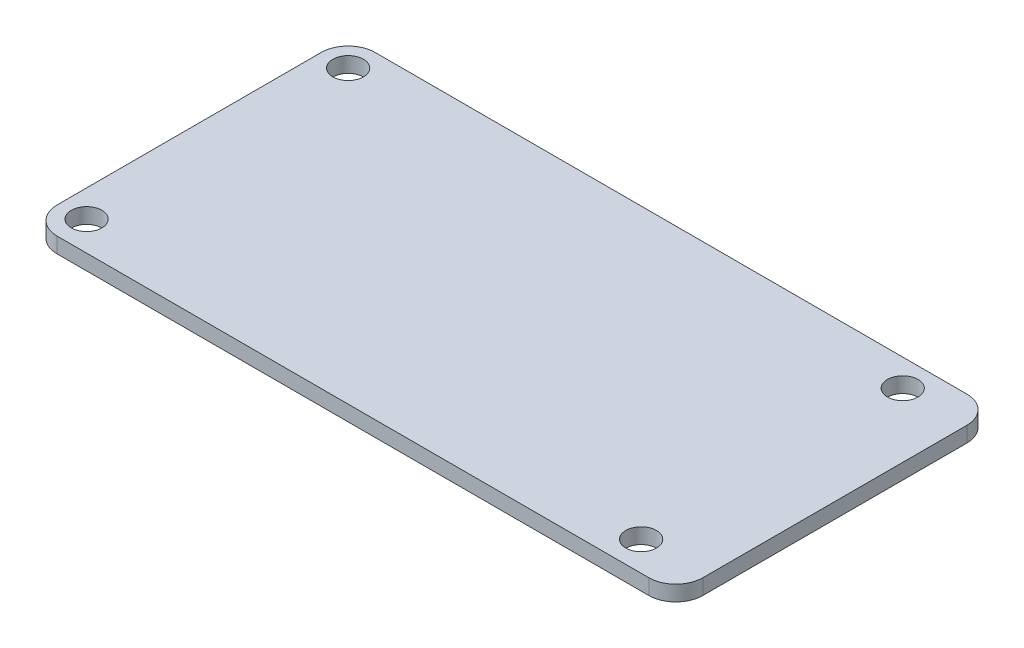
ISO-10303-21;
HEADER;
FILE_DESCRIPTION(('STEP AP214'),'2;1');
FILE_NAME('part.step','',(''),(''),'','','');
FILE_SCHEMA(('AUTOMOTIVE_DESIGN { 1 0 10303 214 1 1 1 1 }'));
ENDSEC;
DATA;
#1=APPLICATION_CONTEXT('core data for automotive mechanical design processes');
#2=APPLICATION_PROTOCOL_DEFINITION('international standard','automotive_design',2000,#1);
#3=PRODUCT_CONTEXT('',#1,'mechanical');
#4=PRODUCT('Part','Part','',(#3));
#5=PRODUCT_RELATED_PRODUCT_CATEGORY('part','',(#4));
#6=PRODUCT_DEFINITION_FORMATION('','',#4);
#7=PRODUCT_DEFINITION_CONTEXT('part definition',#1,'design');
#8=PRODUCT_DEFINITION('design','',#6,#7);
#9=PRODUCT_DEFINITION_SHAPE('','',#8);
#10=(LENGTH_UNIT() NAMED_UNIT(*) SI_UNIT(.MILLI.,.METRE.));
#11=(NAMED_UNIT(*) PLANE_ANGLE_UNIT() SI_UNIT($,.RADIAN.));
#12=(NAMED_UNIT(*) SI_UNIT($,.STERADIAN.) SOLID_ANGLE_UNIT());
#13=UNCERTAINTY_MEASURE_WITH_UNIT(LENGTH_MEASURE(1.E-05),#10,'distance_accuracy_value','');
#14=(GEOMETRIC_REPRESENTATION_CONTEXT(3) GLOBAL_UNCERTAINTY_ASSIGNED_CONTEXT((#13)) GLOBAL_UNIT_ASSIGNED_CONTEXT((#10,
#11,#12)) REPRESENTATION_CONTEXT('',''));
#15=CARTESIAN_POINT('',(0.,0.,0.));
#16=DIRECTION('',(0.,0.,1.));
#17=DIRECTION('',(1.,0.,0.));
#18=AXIS2_PLACEMENT_3D('',#15,#16,#17);
#19=CARTESIAN_POINT('',(-30.697,1.6,-13.697));
#20=DIRECTION('',(0.,-1.,0.));
#21=DIRECTION('',(0.,0.,-1.));
#22=AXIS2_PLACEMENT_3D('',#19,#20,#21);
#23=PLANE('',#22);
#24=CARTESIAN_POINT('',(-30.697,1.6,-13.697));
#25=DIRECTION('',(0.,1.,0.));
#26=DIRECTION('',(0.,0.,-1.));
#27=AXIS2_PLACEMENT_3D('',#24,#25,#26);
#28=CIRCLE('',#27,2.80299999999999);
#29=CARTESIAN_POINT('',(-30.697,1.6,-16.5));
#30=VERTEX_POINT('',#29);
#31=CARTESIAN_POINT('',(-33.5,1.6,-13.697));
#32=VERTEX_POINT('',#31);
#33=EDGE_CURVE('E145',#30,#32,#28,.T.);
#34=ORIENTED_EDGE('',*,*,#33,.T.);
#35=DIRECTION('',(0.,0.,1.));
#36=VECTOR('',#35,1.);
#37=CARTESIAN_POINT('',(-33.5,1.6,-13.697));
#38=LINE('',#37,#36);
#39=CARTESIAN_POINT('',(-33.5,1.6,13.697));
#40=VERTEX_POINT('',#39);
#41=EDGE_CURVE('E93',#32,#40,#38,.T.);
#42=ORIENTED_EDGE('',*,*,#41,.T.);
#43=CARTESIAN_POINT('',(-30.697,1.6,13.697));
#44=DIRECTION('',(0.,1.,0.));
#45=DIRECTION('',(0.,0.,-1.));
#46=AXIS2_PLACEMENT_3D('',#43,#44,#45);
#47=CIRCLE('',#46,2.80299999999999);
#48=CARTESIAN_POINT('',(-30.697,1.6,16.5));
#49=VERTEX_POINT('',#48);
#50=EDGE_CURVE('E160',#40,#49,#47,.T.);
#51=ORIENTED_EDGE('',*,*,#50,.T.);
#52=DIRECTION('',(1.,0.,0.));
#53=VECTOR('',#52,1.);
#54=CARTESIAN_POINT('',(-30.697,1.6,16.5));
#55=LINE('',#54,#53);
#56=CARTESIAN_POINT('',(30.697,1.6,16.5));
#57=VERTEX_POINT('',#56);
#58=EDGE_CURVE('E173',#49,#57,#55,.T.);
#59=ORIENTED_EDGE('',*,*,#58,.T.);
#60=CARTESIAN_POINT('',(30.697,1.6,13.697));
#61=DIRECTION('',(0.,1.,0.));
#62=DIRECTION('',(0.,0.,-1.));
#63=AXIS2_PLACEMENT_3D('',#60,#61,#62);
#64=CIRCLE('',#63,2.80299999999999);
#65=CARTESIAN_POINT('',(33.5,1.6,13.697));
#66=VERTEX_POINT('',#65);
#67=EDGE_CURVE('E112',#57,#66,#64,.T.);
#68=ORIENTED_EDGE('',*,*,#67,.T.);
#69=DIRECTION('',(0.,0.,-1.));
#70=VECTOR('',#69,1.);
#71=CARTESIAN_POINT('',(33.5,1.6,-13.697));
#72=LINE('',#71,#70);
#73=CARTESIAN_POINT('',(33.5,1.6,-13.697));
#74=VERTEX_POINT('',#73);
#75=EDGE_CURVE('E106',#66,#74,#72,.T.);
#76=ORIENTED_EDGE('',*,*,#75,.T.);
#77=CARTESIAN_POINT('',(30.697,1.6,-13.697));
#78=DIRECTION('',(0.,1.,0.));
#79=DIRECTION('',(0.,0.,-1.));
#80=AXIS2_PLACEMENT_3D('',#77,#78,#79);
#81=CIRCLE('',#80,2.80299999999999);
#82=CARTESIAN_POINT('',(30.697,1.6,-16.5));
#83=VERTEX_POINT('',#82);
#84=EDGE_CURVE('E110',#74,#83,#81,.T.);
#85=ORIENTED_EDGE('',*,*,#84,.T.);
#86=DIRECTION('',(-1.,0.,0.));
#87=VECTOR('',#86,1.);
#88=CARTESIAN_POINT('',(-30.697,1.6,-16.5));
#89=LINE('',#88,#87);
#90=EDGE_CURVE('E50',#83,#30,#89,.T.);
#91=ORIENTED_EDGE('',*,*,#90,.T.);
#92=EDGE_LOOP('',(#34,#42,#51,#59,#68,#76,#85,#91));
#93=FACE_BOUND('',#92,.T.);
#94=CARTESIAN_POINT('',(-30.697,1.6,-13.697));
#95=DIRECTION('',(0.,1.,0.));
#96=DIRECTION('',(0.,0.,1.));
#97=AXIS2_PLACEMENT_3D('',#94,#95,#96);
#98=CIRCLE('',#97,1.5875);
#99=CARTESIAN_POINT('',(-30.697,1.6,-12.1095));
#100=VERTEX_POINT('',#99);
#101=EDGE_CURVE('E134',#100,#100,#98,.T.);
#102=ORIENTED_EDGE('',*,*,#101,.F.);
#103=EDGE_LOOP('',(#102));
#104=FACE_BOUND('',#103,.T.);
#105=CARTESIAN_POINT('',(26.843,1.6,-13.697));
#106=DIRECTION('',(0.,1.,0.));
#107=DIRECTION('',(0.,0.,1.));
#108=AXIS2_PLACEMENT_3D('',#105,#106,#107);
#109=CIRCLE('',#108,1.5875);
#110=CARTESIAN_POINT('',(26.843,1.6,-12.1095));
#111=VERTEX_POINT('',#110);
#112=EDGE_CURVE('E182',#111,#111,#109,.T.);
#113=ORIENTED_EDGE('',*,*,#112,.F.);
#114=EDGE_LOOP('',(#113));
#115=FACE_BOUND('',#114,.T.);
#116=CARTESIAN_POINT('',(26.843,1.6,13.443));
#117=DIRECTION('',(0.,1.,0.));
#118=DIRECTION('',(0.,0.,1.));
#119=AXIS2_PLACEMENT_3D('',#116,#117,#118);
#120=CIRCLE('',#119,1.5875);
#121=CARTESIAN_POINT('',(26.843,1.6,15.0305));
#122=VERTEX_POINT('',#121);
#123=EDGE_CURVE('E188',#122,#122,#120,.T.);
#124=ORIENTED_EDGE('',*,*,#123,.F.);
#125=EDGE_LOOP('',(#124));
#126=FACE_BOUND('',#125,.T.);
#127=CARTESIAN_POINT('',(-30.697,1.6,13.443));
#128=DIRECTION('',(0.,1.,0.));
#129=DIRECTION('',(0.,0.,1.));
#130=AXIS2_PLACEMENT_3D('',#127,#128,#129);
#131=CIRCLE('',#130,1.5875);
#132=CARTESIAN_POINT('',(-30.697,1.6,15.0305));
#133=VERTEX_POINT('',#132);
#134=EDGE_CURVE('E194',#133,#133,#131,.T.);
#135=ORIENTED_EDGE('',*,*,#134,.F.);
#136=EDGE_LOOP('',(#135));
#137=FACE_BOUND('',#136,.T.);
#138=ADVANCED_FACE('F33',(#93,#104,#115,#126,#137),#23,.F.);
#139=CARTESIAN_POINT('',(-30.697,0.,-13.697));
#140=DIRECTION('',(0.,-1.,0.));
#141=DIRECTION('',(0.,0.,-1.));
#142=AXIS2_PLACEMENT_3D('',#139,#140,#141);
#143=PLANE('',#142);
#144=CARTESIAN_POINT('',(26.843,0.,13.443));
#145=DIRECTION('',(0.,1.,0.));
#146=DIRECTION('',(0.,0.,1.));
#147=AXIS2_PLACEMENT_3D('',#144,#145,#146);
#148=CIRCLE('',#147,1.5875);
#149=CARTESIAN_POINT('',(26.843,0.,15.0305));
#150=VERTEX_POINT('',#149);
#151=EDGE_CURVE('E191',#150,#150,#148,.T.);
#152=ORIENTED_EDGE('',*,*,#151,.T.);
#153=EDGE_LOOP('',(#152));
#154=FACE_BOUND('',#153,.T.);
#155=CARTESIAN_POINT('',(-30.697,0.,-13.697));
#156=DIRECTION('',(0.,1.,0.));
#157=DIRECTION('',(0.,0.,1.));
#158=AXIS2_PLACEMENT_3D('',#155,#156,#157);
#159=CIRCLE('',#158,1.5875);
#160=CARTESIAN_POINT('',(-30.697,0.,-12.1095));
#161=VERTEX_POINT('',#160);
#162=EDGE_CURVE('E179',#161,#161,#159,.T.);
#163=ORIENTED_EDGE('',*,*,#162,.T.);
#164=EDGE_LOOP('',(#163));
#165=FACE_BOUND('',#164,.T.);
#166=CARTESIAN_POINT('',(-30.697,0.,-13.697));
#167=DIRECTION('',(0.,1.,0.));
#168=DIRECTION('',(0.,0.,-1.));
#169=AXIS2_PLACEMENT_3D('',#166,#167,#168);
#170=CIRCLE('',#169,2.80299999999999);
#171=CARTESIAN_POINT('',(-30.697,0.,-16.5));
#172=VERTEX_POINT('',#171);
#173=CARTESIAN_POINT('',(-33.5,0.,-13.697));
#174=VERTEX_POINT('',#173);
#175=EDGE_CURVE('E130',#172,#174,#170,.T.);
#176=ORIENTED_EDGE('',*,*,#175,.F.);
#177=DIRECTION('',(-1.,0.,0.));
#178=VECTOR('',#177,1.);
#179=CARTESIAN_POINT('',(-30.697,0.,-16.5));
#180=LINE('',#179,#178);
#181=CARTESIAN_POINT('',(30.697,0.,-16.5));
#182=VERTEX_POINT('',#181);
#183=EDGE_CURVE('E85',#182,#172,#180,.T.);
#184=ORIENTED_EDGE('',*,*,#183,.F.);
#185=CARTESIAN_POINT('',(30.697,0.,-13.697));
#186=DIRECTION('',(0.,1.,0.));
#187=DIRECTION('',(0.,0.,-1.));
#188=AXIS2_PLACEMENT_3D('',#185,#186,#187);
#189=CIRCLE('',#188,2.80299999999999);
#190=CARTESIAN_POINT('',(33.5,0.,-13.697));
#191=VERTEX_POINT('',#190);
#192=EDGE_CURVE('E79',#191,#182,#189,.T.);
#193=ORIENTED_EDGE('',*,*,#192,.F.);
#194=DIRECTION('',(0.,0.,-1.));
#195=VECTOR('',#194,1.);
#196=CARTESIAN_POINT('',(33.5,0.,-13.697));
#197=LINE('',#196,#195);
#198=CARTESIAN_POINT('',(33.5,0.,13.697));
#199=VERTEX_POINT('',#198);
#200=EDGE_CURVE('E120',#199,#191,#197,.T.);
#201=ORIENTED_EDGE('',*,*,#200,.F.);
#202=CARTESIAN_POINT('',(30.697,0.,13.697));
#203=DIRECTION('',(0.,1.,0.));
#204=DIRECTION('',(0.,0.,-1.));
#205=AXIS2_PLACEMENT_3D('',#202,#203,#204);
#206=CIRCLE('',#205,2.80299999999999);
#207=CARTESIAN_POINT('',(30.697,0.,16.5));
#208=VERTEX_POINT('',#207);
#209=EDGE_CURVE('E140',#208,#199,#206,.T.);
#210=ORIENTED_EDGE('',*,*,#209,.F.);
#211=DIRECTION('',(1.,0.,0.));
#212=VECTOR('',#211,1.);
#213=CARTESIAN_POINT('',(-30.697,0.,16.5));
#214=LINE('',#213,#212);
#215=CARTESIAN_POINT('',(-30.697,0.,16.5));
#216=VERTEX_POINT('',#215);
#217=EDGE_CURVE('E138',#216,#208,#214,.T.);
#218=ORIENTED_EDGE('',*,*,#217,.F.);
#219=CARTESIAN_POINT('',(-30.697,0.,13.697));
#220=DIRECTION('',(0.,1.,0.));
#221=DIRECTION('',(0.,0.,-1.));
#222=AXIS2_PLACEMENT_3D('',#219,#220,#221);
#223=CIRCLE('',#222,2.80299999999999);
#224=CARTESIAN_POINT('',(-33.5,0.,13.697));
#225=VERTEX_POINT('',#224);
#226=EDGE_CURVE('E136',#225,#216,#223,.T.);
#227=ORIENTED_EDGE('',*,*,#226,.F.);
#228=DIRECTION('',(0.,0.,1.));
#229=VECTOR('',#228,1.);
#230=CARTESIAN_POINT('',(-33.5,0.,-13.697));
#231=LINE('',#230,#229);
#232=EDGE_CURVE('E133',#174,#225,#231,.T.);
#233=ORIENTED_EDGE('',*,*,#232,.F.);
#234=EDGE_LOOP('',(#176,#184,#193,#201,#210,#218,#227,#233));
#235=FACE_BOUND('',#234,.T.);
#236=CARTESIAN_POINT('',(26.843,0.,-13.697));
#237=DIRECTION('',(0.,1.,0.));
#238=DIRECTION('',(0.,0.,1.));
#239=AXIS2_PLACEMENT_3D('',#236,#237,#238);
#240=CIRCLE('',#239,1.5875);
#241=CARTESIAN_POINT('',(26.843,0.,-12.1095));
#242=VERTEX_POINT('',#241);
#243=EDGE_CURVE('E185',#242,#242,#240,.T.);
#244=ORIENTED_EDGE('',*,*,#243,.T.);
#245=EDGE_LOOP('',(#244));
#246=FACE_BOUND('',#245,.T.);
#247=CARTESIAN_POINT('',(-30.697,0.,13.443));
#248=DIRECTION('',(0.,1.,0.));
#249=DIRECTION('',(0.,0.,1.));
#250=AXIS2_PLACEMENT_3D('',#247,#248,#249);
#251=CIRCLE('',#250,1.5875);
#252=CARTESIAN_POINT('',(-30.697,0.,15.0305));
#253=VERTEX_POINT('',#252);
#254=EDGE_CURVE('E197',#253,#253,#251,.T.);
#255=ORIENTED_EDGE('',*,*,#254,.T.);
#256=EDGE_LOOP('',(#255));
#257=FACE_BOUND('',#256,.T.);
#258=ADVANCED_FACE('F164',(#154,#165,#235,#246,#257),#143,.T.);
#259=CARTESIAN_POINT('',(-30.697,1.6,-13.697));
#260=DIRECTION('',(0.,-1.,0.));
#261=DIRECTION('',(0.,0.,-1.));
#262=AXIS2_PLACEMENT_3D('',#259,#260,#261);
#263=CYLINDRICAL_SURFACE('',#262,2.80299999999999);
#264=ORIENTED_EDGE('',*,*,#175,.T.);
#265=DIRECTION('',(0.,-1.,0.));
#266=VECTOR('',#265,1.);
#267=CARTESIAN_POINT('',(-33.5,1.6,-13.697));
#268=LINE('',#267,#266);
#269=EDGE_CURVE('E11',#32,#174,#268,.T.);
#270=ORIENTED_EDGE('',*,*,#269,.F.);
#271=ORIENTED_EDGE('',*,*,#33,.F.);
#272=DIRECTION('',(0.,-1.,0.));
#273=VECTOR('',#272,1.);
#274=CARTESIAN_POINT('',(-30.697,1.6,-16.5));
#275=LINE('',#274,#273);
#276=EDGE_CURVE('E126',#30,#172,#275,.T.);
#277=ORIENTED_EDGE('',*,*,#276,.T.);
#278=EDGE_LOOP('',(#264,#270,#271,#277));
#279=FACE_BOUND('',#278,.T.);
#280=ADVANCED_FACE('F35',(#279),#263,.T.);
#281=CARTESIAN_POINT('',(-33.5,1.6,-13.697));
#282=DIRECTION('',(1.,0.,0.));
#283=DIRECTION('',(0.,0.,-1.));
#284=AXIS2_PLACEMENT_3D('',#281,#282,#283);
#285=PLANE('',#284);
#286=ORIENTED_EDGE('',*,*,#232,.T.);
#287=DIRECTION('',(0.,-1.,0.));
#288=VECTOR('',#287,1.);
#289=CARTESIAN_POINT('',(-33.5,1.6,13.697));
#290=LINE('',#289,#288);
#291=EDGE_CURVE('E42',#40,#225,#290,.T.);
#292=ORIENTED_EDGE('',*,*,#291,.F.);
#293=ORIENTED_EDGE('',*,*,#41,.F.);
#294=ORIENTED_EDGE('',*,*,#269,.T.);
#295=EDGE_LOOP('',(#286,#292,#293,#294));
#296=FACE_BOUND('',#295,.T.);
#297=ADVANCED_FACE('F229',(#296),#285,.F.);
#298=CARTESIAN_POINT('',(-30.697,1.6,13.697));
#299=DIRECTION('',(0.,-1.,0.));
#300=DIRECTION('',(0.,0.,-1.));
#301=AXIS2_PLACEMENT_3D('',#298,#299,#300);
#302=CYLINDRICAL_SURFACE('',#301,2.80299999999999);
#303=ORIENTED_EDGE('',*,*,#226,.T.);
#304=DIRECTION('',(0.,-1.,0.));
#305=VECTOR('',#304,1.);
#306=CARTESIAN_POINT('',(-30.697,1.6,16.5));
#307=LINE('',#306,#305);
#308=EDGE_CURVE('E152',#49,#216,#307,.T.);
#309=ORIENTED_EDGE('',*,*,#308,.F.);
#310=ORIENTED_EDGE('',*,*,#50,.F.);
#311=ORIENTED_EDGE('',*,*,#291,.T.);
#312=EDGE_LOOP('',(#303,#309,#310,#311));
#313=FACE_BOUND('',#312,.T.);
#314=ADVANCED_FACE('F158',(#313),#302,.T.);
#315=CARTESIAN_POINT('',(-30.697,1.6,16.5));
#316=DIRECTION('',(0.,0.,-1.));
#317=DIRECTION('',(-1.,0.,0.));
#318=AXIS2_PLACEMENT_3D('',#315,#316,#317);
#319=PLANE('',#318);
#320=ORIENTED_EDGE('',*,*,#217,.T.);
#321=DIRECTION('',(0.,-1.,0.));
#322=VECTOR('',#321,1.);
#323=CARTESIAN_POINT('',(30.697,1.6,16.5));
#324=LINE('',#323,#322);
#325=EDGE_CURVE('E149',#57,#208,#324,.T.);
#326=ORIENTED_EDGE('',*,*,#325,.F.);
#327=ORIENTED_EDGE('',*,*,#58,.F.);
#328=ORIENTED_EDGE('',*,*,#308,.T.);
#329=EDGE_LOOP('',(#320,#326,#327,#328));
#330=FACE_BOUND('',#329,.T.);
#331=ADVANCED_FACE('F169',(#330),#319,.F.);
#332=CARTESIAN_POINT('',(30.697,1.6,13.697));
#333=DIRECTION('',(0.,-1.,0.));
#334=DIRECTION('',(0.,0.,-1.));
#335=AXIS2_PLACEMENT_3D('',#332,#333,#334);
#336=CYLINDRICAL_SURFACE('',#335,2.80299999999999);
#337=ORIENTED_EDGE('',*,*,#209,.T.);
#338=DIRECTION('',(0.,-1.,0.));
#339=VECTOR('',#338,1.);
#340=CARTESIAN_POINT('',(33.5,1.6,13.697));
#341=LINE('',#340,#339);
#342=EDGE_CURVE('E121',#66,#199,#341,.T.);
#343=ORIENTED_EDGE('',*,*,#342,.F.);
#344=ORIENTED_EDGE('',*,*,#67,.F.);
#345=ORIENTED_EDGE('',*,*,#325,.T.);
#346=EDGE_LOOP('',(#337,#343,#344,#345));
#347=FACE_BOUND('',#346,.T.);
#348=ADVANCED_FACE('F172',(#347),#336,.T.);
#349=CARTESIAN_POINT('',(33.5,1.6,-13.697));
#350=DIRECTION('',(-1.,0.,0.));
#351=DIRECTION('',(0.,0.,1.));
#352=AXIS2_PLACEMENT_3D('',#349,#350,#351);
#353=PLANE('',#352);
#354=ORIENTED_EDGE('',*,*,#200,.T.);
#355=DIRECTION('',(0.,-1.,0.));
#356=VECTOR('',#355,1.);
#357=CARTESIAN_POINT('',(33.5,1.6,-13.697));
#358=LINE('',#357,#356);
#359=EDGE_CURVE('E117',#74,#191,#358,.T.);
#360=ORIENTED_EDGE('',*,*,#359,.F.);
#361=ORIENTED_EDGE('',*,*,#75,.F.);
#362=ORIENTED_EDGE('',*,*,#342,.T.);
#363=EDGE_LOOP('',(#354,#360,#361,#362));
#364=FACE_BOUND('',#363,.T.);
#365=ADVANCED_FACE('F118',(#364),#353,.F.);
#366=CARTESIAN_POINT('',(30.697,1.6,-13.697));
#367=DIRECTION('',(0.,-1.,0.));
#368=DIRECTION('',(0.,0.,-1.));
#369=AXIS2_PLACEMENT_3D('',#366,#367,#368);
#370=CYLINDRICAL_SURFACE('',#369,2.80299999999999);
#371=ORIENTED_EDGE('',*,*,#192,.T.);
#372=DIRECTION('',(0.,-1.,0.));
#373=VECTOR('',#372,1.);
#374=CARTESIAN_POINT('',(30.697,1.6,-16.5));
#375=LINE('',#374,#373);
#376=EDGE_CURVE('E122',#83,#182,#375,.T.);
#377=ORIENTED_EDGE('',*,*,#376,.F.);
#378=ORIENTED_EDGE('',*,*,#84,.F.);
#379=ORIENTED_EDGE('',*,*,#359,.T.);
#380=EDGE_LOOP('',(#371,#377,#378,#379));
#381=FACE_BOUND('',#380,.T.);
#382=ADVANCED_FACE('F124',(#381),#370,.T.);
#383=CARTESIAN_POINT('',(-30.697,1.6,-16.5));
#384=DIRECTION('',(0.,0.,1.));
#385=DIRECTION('',(1.,0.,0.));
#386=AXIS2_PLACEMENT_3D('',#383,#384,#385);
#387=PLANE('',#386);
#388=ORIENTED_EDGE('',*,*,#183,.T.);
#389=ORIENTED_EDGE('',*,*,#276,.F.);
#390=ORIENTED_EDGE('',*,*,#90,.F.);
#391=ORIENTED_EDGE('',*,*,#376,.T.);
#392=EDGE_LOOP('',(#388,#389,#390,#391));
#393=FACE_BOUND('',#392,.T.);
#394=ADVANCED_FACE('F217',(#393),#387,.F.);
#395=CARTESIAN_POINT('',(-30.697,1.6,-13.697));
#396=DIRECTION('',(0.,-1.,0.));
#397=DIRECTION('',(0.,0.,-1.));
#398=AXIS2_PLACEMENT_3D('',#395,#396,#397);
#399=CYLINDRICAL_SURFACE('',#398,1.5875);
#400=ORIENTED_EDGE('',*,*,#101,.T.);
#401=EDGE_LOOP('',(#400));
#402=FACE_BOUND('',#401,.T.);
#403=ORIENTED_EDGE('',*,*,#162,.F.);
#404=EDGE_LOOP('',(#403));
#405=FACE_BOUND('',#404,.T.);
#406=ADVANCED_FACE('F214',(#402,#405),#399,.F.);
#407=CARTESIAN_POINT('',(26.843,1.6,-13.697));
#408=DIRECTION('',(0.,-1.,0.));
#409=DIRECTION('',(0.,0.,-1.));
#410=AXIS2_PLACEMENT_3D('',#407,#408,#409);
#411=CYLINDRICAL_SURFACE('',#410,1.5875);
#412=ORIENTED_EDGE('',*,*,#112,.T.);
#413=EDGE_LOOP('',(#412));
#414=FACE_BOUND('',#413,.T.);
#415=ORIENTED_EDGE('',*,*,#243,.F.);
#416=EDGE_LOOP('',(#415));
#417=FACE_BOUND('',#416,.T.);
#418=ADVANCED_FACE('F293',(#414,#417),#411,.F.);
#419=CARTESIAN_POINT('',(26.843,1.6,13.443));
#420=DIRECTION('',(0.,-1.,0.));
#421=DIRECTION('',(0.,0.,-1.));
#422=AXIS2_PLACEMENT_3D('',#419,#420,#421);
#423=CYLINDRICAL_SURFACE('',#422,1.5875);
#424=ORIENTED_EDGE('',*,*,#123,.T.);
#425=EDGE_LOOP('',(#424));
#426=FACE_BOUND('',#425,.T.);
#427=ORIENTED_EDGE('',*,*,#151,.F.);
#428=EDGE_LOOP('',(#427));
#429=FACE_BOUND('',#428,.T.);
#430=ADVANCED_FACE('F301',(#426,#429),#423,.F.);
#431=CARTESIAN_POINT('',(-30.697,1.6,13.443));
#432=DIRECTION('',(0.,-1.,0.));
#433=DIRECTION('',(0.,0.,-1.));
#434=AXIS2_PLACEMENT_3D('',#431,#432,#433);
#435=CYLINDRICAL_SURFACE('',#434,1.5875);
#436=ORIENTED_EDGE('',*,*,#134,.T.);
#437=EDGE_LOOP('',(#436));
#438=FACE_BOUND('',#437,.T.);
#439=ORIENTED_EDGE('',*,*,#254,.F.);
#440=EDGE_LOOP('',(#439));
#441=FACE_BOUND('',#440,.T.);
#442=ADVANCED_FACE('F203',(#438,#441),#435,.F.);
#443=CLOSED_SHELL('',(#138,#258,#280,#297,#314,#331,#348,#365,#382,#394,#406,#418,#430,#442));
#444=MANIFOLD_SOLID_BREP('B2',#443);
#445=ADVANCED_BREP_SHAPE_REPRESENTATION('',(#18,#444),#14);
#446=SHAPE_DEFINITION_REPRESENTATION(#9,#445);
ENDSEC;
END-ISO-10303-21;
